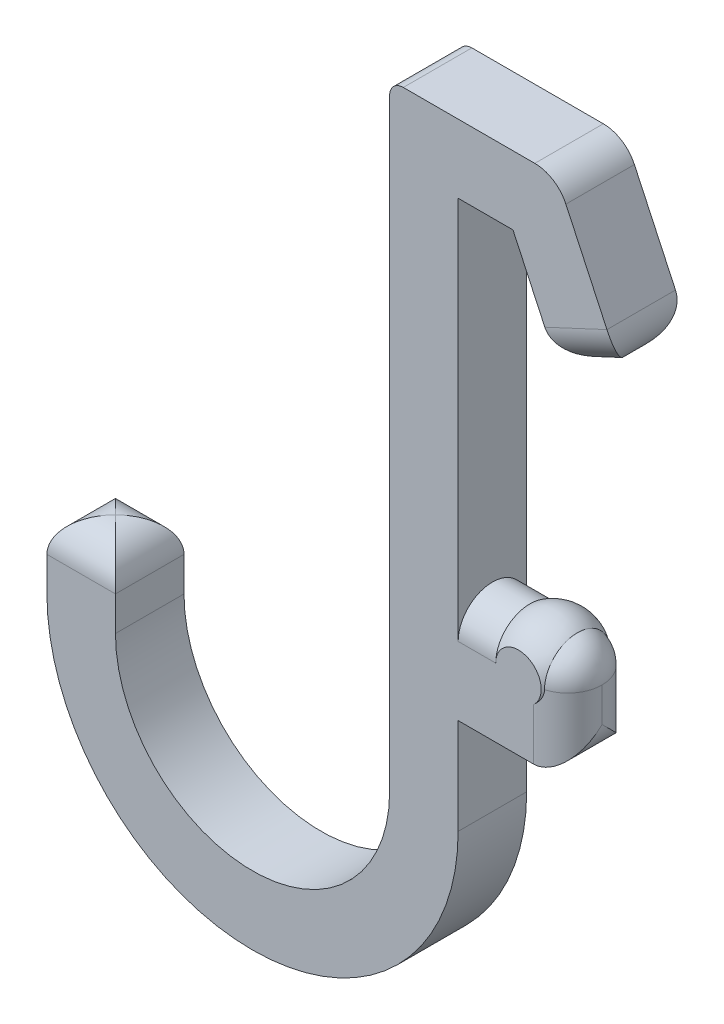
ISO-10303-21;
HEADER;
FILE_DESCRIPTION(('STEP AP214'),'2;1');
FILE_NAME('part.step','',(''),(''),'','','');
FILE_SCHEMA(('AUTOMOTIVE_DESIGN { 1 0 10303 214 1 1 1 1 }'));
ENDSEC;
DATA;
#1=APPLICATION_CONTEXT('core data for automotive mechanical design processes');
#2=APPLICATION_PROTOCOL_DEFINITION('international standard','automotive_design',2000,#1);
#3=PRODUCT_CONTEXT('',#1,'mechanical');
#4=PRODUCT('Part','Part','',(#3));
#5=PRODUCT_RELATED_PRODUCT_CATEGORY('part','',(#4));
#6=PRODUCT_DEFINITION_FORMATION('','',#4);
#7=PRODUCT_DEFINITION_CONTEXT('part definition',#1,'design');
#8=PRODUCT_DEFINITION('design','',#6,#7);
#9=PRODUCT_DEFINITION_SHAPE('','',#8);
#10=(LENGTH_UNIT() NAMED_UNIT(*) SI_UNIT(.MILLI.,.METRE.));
#11=(NAMED_UNIT(*) PLANE_ANGLE_UNIT() SI_UNIT($,.RADIAN.));
#12=(NAMED_UNIT(*) SI_UNIT($,.STERADIAN.) SOLID_ANGLE_UNIT());
#13=UNCERTAINTY_MEASURE_WITH_UNIT(LENGTH_MEASURE(1.E-05),#10,'distance_accuracy_value','');
#14=(GEOMETRIC_REPRESENTATION_CONTEXT(3) GLOBAL_UNCERTAINTY_ASSIGNED_CONTEXT((#13)) GLOBAL_UNIT_ASSIGNED_CONTEXT((#10,
#11,#12)) REPRESENTATION_CONTEXT('',''));
#15=CARTESIAN_POINT('',(0.,0.,0.));
#16=DIRECTION('',(0.,0.,1.));
#17=DIRECTION('',(1.,0.,0.));
#18=AXIS2_PLACEMENT_3D('',#15,#16,#17);
#19=CARTESIAN_POINT('',(13.5901699437495,0.,2.5));
#20=DIRECTION('',(-1.,0.,0.));
#21=DIRECTION('',(0.,0.,1.));
#22=AXIS2_PLACEMENT_3D('',#19,#20,#21);
#23=CYLINDRICAL_SURFACE('',#22,2.5);
#24=CARTESIAN_POINT('',(2.7416876048223,0.,2.5));
#25=DIRECTION('',(1.,0.,0.));
#26=DIRECTION('',(0.,0.,-1.));
#27=AXIS2_PLACEMENT_3D('',#24,#25,#26);
#28=CIRCLE('',#27,2.5);
#29=CARTESIAN_POINT('',(2.7416876048223,0.,0.));
#30=VERTEX_POINT('',#29);
#31=CARTESIAN_POINT('',(2.7416876048223,0.,5.));
#32=VERTEX_POINT('',#31);
#33=EDGE_CURVE('E239',#30,#32,#28,.T.);
#34=ORIENTED_EDGE('',*,*,#33,.F.);
#35=DIRECTION('',(-1.,0.,0.));
#36=VECTOR('',#35,1.);
#37=CARTESIAN_POINT('',(0.,0.,0.));
#38=LINE('',#37,#36);
#39=CARTESIAN_POINT('',(0.,0.,0.));
#40=VERTEX_POINT('',#39);
#41=EDGE_CURVE('E326',#30,#40,#38,.T.);
#42=ORIENTED_EDGE('',*,*,#41,.T.);
#43=CARTESIAN_POINT('',(0.,0.,2.5));
#44=DIRECTION('',(1.,0.,0.));
#45=DIRECTION('',(0.,0.,-1.));
#46=AXIS2_PLACEMENT_3D('',#43,#44,#45);
#47=CIRCLE('',#46,2.5);
#48=CARTESIAN_POINT('',(0.,0.,5.));
#49=VERTEX_POINT('',#48);
#50=EDGE_CURVE('E250',#40,#49,#47,.T.);
#51=ORIENTED_EDGE('',*,*,#50,.T.);
#52=DIRECTION('',(-1.,0.,0.));
#53=VECTOR('',#52,1.);
#54=CARTESIAN_POINT('',(0.,0.,5.));
#55=LINE('',#54,#53);
#56=EDGE_CURVE('E287',#32,#49,#55,.T.);
#57=ORIENTED_EDGE('',*,*,#56,.F.);
#58=EDGE_LOOP('',(#34,#42,#51,#57));
#59=FACE_BOUND('',#58,.T.);
#60=ADVANCED_FACE('F40',(#59),#23,.T.);
#61=CARTESIAN_POINT('',(5.5,0.,2.5));
#62=DIRECTION('',(0.,1.,0.));
#63=DIRECTION('',(0.,0.,1.));
#64=AXIS2_PLACEMENT_3D('',#61,#62,#63);
#65=CYLINDRICAL_SURFACE('',#64,2.5);
#66=DIRECTION('',(0.,1.,0.));
#67=VECTOR('',#66,1.);
#68=CARTESIAN_POINT('',(5.5,-12.,0.));
#69=LINE('',#68,#67);
#70=CARTESIAN_POINT('',(5.5,-1.24096736459909,0.));
#71=VERTEX_POINT('',#70);
#72=CARTESIAN_POINT('',(5.5,-5.,0.));
#73=VERTEX_POINT('',#72);
#74=EDGE_CURVE('E59',#71,#73,#69,.F.);
#75=ORIENTED_EDGE('',*,*,#74,.F.);
#76=CARTESIAN_POINT('',(5.4998,-1.24114463299005,8.00000016901504E-09));
#77=CARTESIAN_POINT('',(5.5363929673262,-1.2087029649529,-9.26164938524013E-06));
#78=CARTESIAN_POINT('',(5.57236876038989,-1.17555626849876,0.00079770122016531));
#79=CARTESIAN_POINT('',(5.6428030561148,-1.10769667819631,0.00383433659862395));
#80=CARTESIAN_POINT('',(5.67726031215857,-1.07298254322827,0.0060651555671746));
#81=CARTESIAN_POINT('',(5.74519128912905,-1.00095424317269,0.0118132669352872));
#82=CARTESIAN_POINT('',(5.77861573042543,-0.963595826296857,0.0153626740978217));
#83=CARTESIAN_POINT('',(5.84305795009588,-0.886981329738944,0.0234356736079334));
#84=CARTESIAN_POINT('',(5.8740762229525,-0.847725642663384,0.0279590650703918));
#85=CARTESIAN_POINT('',(5.96325201148396,-0.726269508254624,0.042561851108955));
#86=CARTESIAN_POINT('',(6.01705538420124,-0.640865596374251,0.0536260746175859));
#87=CARTESIAN_POINT('',(6.10655009460944,-0.461922147892546,0.074258393974845));
#88=CARTESIAN_POINT('',(6.14249859084772,-0.368522297372846,0.0838462716282918));
#89=CARTESIAN_POINT('',(6.17730370336194,-0.227795718404401,0.0934686773099391));
#90=CARTESIAN_POINT('',(6.18570287472368,-0.1829602446012,0.0958641595546958));
#91=CARTESIAN_POINT('',(6.19710907659667,-0.0920455434275466,0.0991560697495525));
#92=CARTESIAN_POINT('',(6.20005395659277,-0.0459579806521387,0.100035211650277));
#93=CARTESIAN_POINT('',(6.19999998181818,0.000200000000000188,0.0999999946969703));
#94=B_SPLINE_CURVE_WITH_KNOTS('',3,(#76,#77,#78,#79,#80,#81,#82,#83,#84,#85,#86,#87,#88,#89,#90,
#91,#92,#93),.UNSPECIFIED.,.F.,.F.,(4,2,2,2,2,2,2,2,4),(0.,0.146701218214616,0.29352070649968,
0.444179394748281,0.594807039223552,0.898088830284032,1.196865790681,1.3335683412279,
1.47181922641049),.UNSPECIFIED.);
#95=CARTESIAN_POINT('',(6.2,0.,0.100000000000001));
#96=VERTEX_POINT('',#95);
#97=EDGE_CURVE('E272',#71,#96,#94,.T.);
#98=ORIENTED_EDGE('',*,*,#97,.T.);
#99=CARTESIAN_POINT('',(5.5,0.,2.5));
#100=DIRECTION('',(0.,1.,0.));
#101=DIRECTION('',(0.,0.,1.));
#102=AXIS2_PLACEMENT_3D('',#99,#100,#101);
#103=CIRCLE('',#102,2.5);
#104=CARTESIAN_POINT('',(8.,0.,2.5));
#105=VERTEX_POINT('',#104);
#106=EDGE_CURVE('E82',#105,#96,#103,.T.);
#107=ORIENTED_EDGE('',*,*,#106,.F.);
#108=DIRECTION('',(0.,1.,0.));
#109=VECTOR('',#108,1.);
#110=CARTESIAN_POINT('',(8.,0.,2.5));
#111=LINE('',#110,#109);
#112=CARTESIAN_POINT('',(8.,-2.5,2.5));
#113=VERTEX_POINT('',#112);
#114=EDGE_CURVE('E243',#113,#105,#111,.T.);
#115=ORIENTED_EDGE('',*,*,#114,.F.);
#116=CARTESIAN_POINT('',(5.5,-2.5,2.5));
#117=DIRECTION('',(0.,0.707106781186547,-0.707106781186547));
#118=DIRECTION('',(0.,-0.707106781186547,-0.707106781186547));
#119=AXIS2_PLACEMENT_3D('',#116,#117,#118);
#120=ELLIPSE('',#119,3.53553390593274,2.5);
#121=EDGE_CURVE('E72',#73,#113,#120,.F.);
#122=ORIENTED_EDGE('',*,*,#121,.F.);
#123=EDGE_LOOP('',(#75,#98,#107,#115,#122));
#124=FACE_BOUND('',#123,.T.);
#125=ADVANCED_FACE('F42',(#124),#65,.T.);
#126=CARTESIAN_POINT('',(5.5,0.,2.5));
#127=DIRECTION('',(-1.,0.,0.));
#128=DIRECTION('',(0.,0.,1.));
#129=AXIS2_PLACEMENT_3D('',#126,#127,#128);
#130=SPHERICAL_SURFACE('',#129,2.5);
#131=ORIENTED_EDGE('',*,*,#106,.T.);
#132=CARTESIAN_POINT('',(6.2,0.,2.5));
#133=DIRECTION('',(-1.,0.,0.));
#134=DIRECTION('',(0.,0.,1.));
#135=AXIS2_PLACEMENT_3D('',#132,#133,#134);
#136=CIRCLE('',#135,2.4);
#137=CARTESIAN_POINT('',(6.2,0.,4.9));
#138=VERTEX_POINT('',#137);
#139=EDGE_CURVE('E280',#96,#138,#136,.F.);
#140=ORIENTED_EDGE('',*,*,#139,.T.);
#141=CARTESIAN_POINT('',(5.5,0.,2.5));
#142=DIRECTION('',(0.,-1.,0.));
#143=DIRECTION('',(0.,0.,-1.));
#144=AXIS2_PLACEMENT_3D('',#141,#142,#143);
#145=CIRCLE('',#144,2.5);
#146=EDGE_CURVE('E234',#105,#138,#145,.T.);
#147=ORIENTED_EDGE('',*,*,#146,.F.);
#148=EDGE_LOOP('',(#131,#140,#147));
#149=FACE_BOUND('',#148,.T.);
#150=ADVANCED_FACE('F515',(#149),#130,.T.);
#151=CARTESIAN_POINT('',(5.5,-12.,2.5));
#152=DIRECTION('',(0.,-1.,0.));
#153=DIRECTION('',(0.,0.,-1.));
#154=AXIS2_PLACEMENT_3D('',#151,#152,#153);
#155=CYLINDRICAL_SURFACE('',#154,2.5);
#156=ORIENTED_EDGE('',*,*,#146,.T.);
#157=CARTESIAN_POINT('',(6.19999998181818,0.0002,4.90000000530303));
#158=CARTESIAN_POINT('',(6.20002060593483,-0.0340215820751626,4.89998817316831));
#159=CARTESIAN_POINT('',(6.1984143593459,-0.0682209096207423,4.90046286433432));
#160=CARTESIAN_POINT('',(6.19208379810463,-0.136249463080852,4.90229830533756));
#161=CARTESIAN_POINT('',(6.18736474729119,-0.170079215952131,4.90365755930238));
#162=CARTESIAN_POINT('',(6.1689482938362,-0.269536910764676,4.90887369332737));
#163=CARTESIAN_POINT('',(6.15098131886339,-0.334336983187606,4.91387497360715));
#164=CARTESIAN_POINT('',(6.09808868579219,-0.48085117024676,4.92759913373652));
#165=CARTESIAN_POINT('',(6.05953499991633,-0.561148858343043,4.9370045157109));
#166=CARTESIAN_POINT('',(5.97007827325949,-0.715449277029459,4.9558368542023));
#167=CARTESIAN_POINT('',(5.91904380010561,-0.789372868652355,4.96526290588241));
#168=CARTESIAN_POINT('',(5.80922506209963,-0.929818254648965,4.98141526656959));
#169=CARTESIAN_POINT('',(5.75055545651681,-0.996426935956446,4.98817650123594));
#170=CARTESIAN_POINT('',(5.65870838300495,-1.09170672728009,4.99514321976577));
#171=CARTESIAN_POINT('',(5.62774086496115,-1.12244386881611,4.99693401300135));
#172=CARTESIAN_POINT('',(5.56461568283012,-1.1826876244331,4.99936451304459));
#173=CARTESIAN_POINT('',(5.53245860969331,-1.21219483443042,5.00000478377816));
#174=CARTESIAN_POINT('',(5.4998,-1.24114463299005,4.999999992));
#175=B_SPLINE_CURVE_WITH_KNOTS('',3,(#157,#158,#159,#160,#161,#162,#163,#164,#165,#166,#167,
#168,#169,#170,#171,#172,#173,#174),.UNSPECIFIED.,.F.,.F.,(4,2,2,2,2,2,2,2,4),(0.,
0.102583403755103,0.204993779301412,0.406260766109182,0.673486519863847,0.943657669752399,
1.21015973265302,1.34112701736425,1.47203009124063),.UNSPECIFIED.);
#176=CARTESIAN_POINT('',(5.5,-1.24096736459909,5.));
#177=VERTEX_POINT('',#176);
#178=EDGE_CURVE('E233',#138,#177,#175,.T.);
#179=ORIENTED_EDGE('',*,*,#178,.T.);
#180=DIRECTION('',(0.,1.,0.));
#181=VECTOR('',#180,1.);
#182=CARTESIAN_POINT('',(5.5,0.,5.));
#183=LINE('',#182,#181);
#184=CARTESIAN_POINT('',(5.5,-5.,5.));
#185=VERTEX_POINT('',#184);
#186=EDGE_CURVE('E222',#185,#177,#183,.T.);
#187=ORIENTED_EDGE('',*,*,#186,.F.);
#188=CARTESIAN_POINT('',(5.5,-2.5,2.5));
#189=DIRECTION('',(0.,-0.707106781186547,-0.707106781186547));
#190=DIRECTION('',(0.,0.707106781186547,-0.707106781186547));
#191=AXIS2_PLACEMENT_3D('',#188,#189,#190);
#192=ELLIPSE('',#191,3.53553390593274,2.5);
#193=EDGE_CURVE('E238',#185,#113,#192,.F.);
#194=ORIENTED_EDGE('',*,*,#193,.T.);
#195=ORIENTED_EDGE('',*,*,#114,.T.);
#196=EDGE_LOOP('',(#156,#179,#187,#194,#195));
#197=FACE_BOUND('',#196,.T.);
#198=ADVANCED_FACE('F259',(#197),#155,.T.);
#199=CARTESIAN_POINT('',(0.,0.,5.));
#200=DIRECTION('',(-1.,0.,0.));
#201=DIRECTION('',(0.,0.,1.));
#202=AXIS2_PLACEMENT_3D('',#199,#200,#201);
#203=PLANE('',#202);
#204=ORIENTED_EDGE('',*,*,#50,.F.);
#205=DIRECTION('',(0.,1.,0.));
#206=VECTOR('',#205,1.);
#207=CARTESIAN_POINT('',(0.,0.,0.));
#208=LINE('',#207,#206);
#209=CARTESIAN_POINT('',(0.,28.,0.));
#210=VERTEX_POINT('',#209);
#211=EDGE_CURVE('E329',#40,#210,#208,.T.);
#212=ORIENTED_EDGE('',*,*,#211,.T.);
#213=DIRECTION('',(0.,0.,-1.));
#214=VECTOR('',#213,1.);
#215=CARTESIAN_POINT('',(0.,28.,5.));
#216=LINE('',#215,#214);
#217=CARTESIAN_POINT('',(0.,28.,5.));
#218=VERTEX_POINT('',#217);
#219=EDGE_CURVE('E390',#218,#210,#216,.T.);
#220=ORIENTED_EDGE('',*,*,#219,.F.);
#221=DIRECTION('',(0.,1.,0.));
#222=VECTOR('',#221,1.);
#223=CARTESIAN_POINT('',(0.,0.,5.));
#224=LINE('',#223,#222);
#225=EDGE_CURVE('E290',#49,#218,#224,.T.);
#226=ORIENTED_EDGE('',*,*,#225,.F.);
#227=EDGE_LOOP('',(#204,#212,#220,#226));
#228=FACE_BOUND('',#227,.T.);
#229=ADVANCED_FACE('F527',(#228),#203,.F.);
#230=CARTESIAN_POINT('',(0.,28.,5.));
#231=DIRECTION('',(0.,1.,0.));
#232=DIRECTION('',(0.,0.,1.));
#233=AXIS2_PLACEMENT_3D('',#230,#231,#232);
#234=PLANE('',#233);
#235=DIRECTION('',(1.,0.,0.));
#236=VECTOR('',#235,1.);
#237=CARTESIAN_POINT('',(0.,28.,0.));
#238=LINE('',#237,#236);
#239=CARTESIAN_POINT('',(4.,28.,0.));
#240=VERTEX_POINT('',#239);
#241=EDGE_CURVE('E333',#210,#240,#238,.T.);
#242=ORIENTED_EDGE('',*,*,#241,.T.);
#243=DIRECTION('',(0.,0.,-1.));
#244=VECTOR('',#243,1.);
#245=CARTESIAN_POINT('',(4.,28.,5.));
#246=LINE('',#245,#244);
#247=CARTESIAN_POINT('',(4.,28.,5.));
#248=VERTEX_POINT('',#247);
#249=EDGE_CURVE('E386',#248,#240,#246,.T.);
#250=ORIENTED_EDGE('',*,*,#249,.F.);
#251=DIRECTION('',(1.,0.,0.));
#252=VECTOR('',#251,1.);
#253=CARTESIAN_POINT('',(0.,28.,5.));
#254=LINE('',#253,#252);
#255=EDGE_CURVE('E294',#218,#248,#254,.T.);
#256=ORIENTED_EDGE('',*,*,#255,.F.);
#257=ORIENTED_EDGE('',*,*,#219,.T.);
#258=EDGE_LOOP('',(#242,#250,#256,#257));
#259=FACE_BOUND('',#258,.T.);
#260=ADVANCED_FACE('F532',(#259),#234,.F.);
#261=CARTESIAN_POINT('',(4.,28.,5.));
#262=DIRECTION('',(0.906307787036651,0.422618261740697,0.));
#263=DIRECTION('',(-0.422618261740697,0.906307787036651,0.));
#264=AXIS2_PLACEMENT_3D('',#261,#262,#263);
#265=PLANE('',#264);
#266=DIRECTION('',(0.422618261740697,-0.906307787036651,0.));
#267=VECTOR('',#266,1.);
#268=CARTESIAN_POINT('',(4.,28.,0.));
#269=LINE('',#268,#267);
#270=CARTESIAN_POINT('',(6.32440043957384,23.0153071712984,0.));
#271=VERTEX_POINT('',#270);
#272=EDGE_CURVE('E336',#240,#271,#269,.T.);
#273=ORIENTED_EDGE('',*,*,#272,.T.);
#274=DIRECTION('',(0.,0.,-1.));
#275=VECTOR('',#274,1.);
#276=CARTESIAN_POINT('',(6.32440043957383,23.0153071712984,5.));
#277=LINE('',#276,#275);
#278=CARTESIAN_POINT('',(6.32440043957383,23.0153071712984,5.));
#279=VERTEX_POINT('',#278);
#280=EDGE_CURVE('E394',#271,#279,#277,.F.);
#281=ORIENTED_EDGE('',*,*,#280,.T.);
#282=DIRECTION('',(0.422618261740697,-0.906307787036651,0.));
#283=VECTOR('',#282,1.);
#284=CARTESIAN_POINT('',(4.,28.,5.));
#285=LINE('',#284,#283);
#286=EDGE_CURVE('E297',#248,#279,#285,.T.);
#287=ORIENTED_EDGE('',*,*,#286,.F.);
#288=ORIENTED_EDGE('',*,*,#249,.T.);
#289=EDGE_LOOP('',(#273,#281,#287,#288));
#290=FACE_BOUND('',#289,.T.);
#291=ADVANCED_FACE('F534',(#290),#265,.F.);
#292=CARTESIAN_POINT('',(11.9124850291088,22.8626290124103,5.));
#293=DIRECTION('',(-0.906307787036651,-0.422618261740697,0.));
#294=DIRECTION('',(0.422618261740697,-0.906307787036651,0.));
#295=AXIS2_PLACEMENT_3D('',#292,#293,#294);
#296=PLANE('',#295);
#297=DIRECTION('',(-0.422618261740697,0.906307787036651,0.));
#298=VECTOR('',#297,1.);
#299=CARTESIAN_POINT('',(11.9124850291088,22.8626290124103,5.));
#300=LINE('',#299,#298);
#301=CARTESIAN_POINT('',(10.8559393747571,25.1283984800019,5.));
#302=VERTEX_POINT('',#301);
#303=CARTESIAN_POINT('',(7.85844511961037,31.5565456543517,5.));
#304=VERTEX_POINT('',#303);
#305=EDGE_CURVE('E215',#302,#304,#300,.T.);
#306=ORIENTED_EDGE('',*,*,#305,.F.);
#307=DIRECTION('',(0.,0.,-1.));
#308=VECTOR('',#307,1.);
#309=CARTESIAN_POINT('',(10.8559393747571,25.1283984800019,5.));
#310=LINE('',#309,#308);
#311=CARTESIAN_POINT('',(10.8559393747571,25.1283984800019,0.));
#312=VERTEX_POINT('',#311);
#313=EDGE_CURVE('E409',#302,#312,#310,.T.);
#314=ORIENTED_EDGE('',*,*,#313,.T.);
#315=DIRECTION('',(-0.422618261740697,0.906307787036651,0.));
#316=VECTOR('',#315,1.);
#317=CARTESIAN_POINT('',(11.9124850291088,22.8626290124103,0.));
#318=LINE('',#317,#316);
#319=CARTESIAN_POINT('',(7.85844511961037,31.5565456543517,0.));
#320=VERTEX_POINT('',#319);
#321=EDGE_CURVE('E340',#312,#320,#318,.T.);
#322=ORIENTED_EDGE('',*,*,#321,.T.);
#323=DIRECTION('',(0.,0.,-1.));
#324=VECTOR('',#323,1.);
#325=CARTESIAN_POINT('',(7.85844511961037,31.5565456543517,5.));
#326=LINE('',#325,#324);
#327=EDGE_CURVE('E406',#320,#304,#326,.F.);
#328=ORIENTED_EDGE('',*,*,#327,.T.);
#329=EDGE_LOOP('',(#306,#314,#322,#328));
#330=FACE_BOUND('',#329,.T.);
#331=ADVANCED_FACE('F548',(#330),#296,.F.);
#332=CARTESIAN_POINT('',(-5.,33.,5.));
#333=DIRECTION('',(0.,-1.,0.));
#334=DIRECTION('',(0.,0.,-1.));
#335=AXIS2_PLACEMENT_3D('',#332,#333,#334);
#336=PLANE('',#335);
#337=DIRECTION('',(-1.,0.,0.));
#338=VECTOR('',#337,1.);
#339=CARTESIAN_POINT('',(-5.,33.,0.));
#340=LINE('',#339,#338);
#341=CARTESIAN_POINT('',(5.59267565201873,33.,0.));
#342=VERTEX_POINT('',#341);
#343=CARTESIAN_POINT('',(-4.,33.,0.));
#344=VERTEX_POINT('',#343);
#345=EDGE_CURVE('E201',#342,#344,#340,.T.);
#346=ORIENTED_EDGE('',*,*,#345,.T.);
#347=DIRECTION('',(0.,0.,-1.));
#348=VECTOR('',#347,1.);
#349=CARTESIAN_POINT('',(-4.,33.,5.));
#350=LINE('',#349,#348);
#351=CARTESIAN_POINT('',(-4.,33.,5.));
#352=VERTEX_POINT('',#351);
#353=EDGE_CURVE('E194',#344,#352,#350,.F.);
#354=ORIENTED_EDGE('',*,*,#353,.T.);
#355=DIRECTION('',(-1.,0.,0.));
#356=VECTOR('',#355,1.);
#357=CARTESIAN_POINT('',(-5.,33.,5.));
#358=LINE('',#357,#356);
#359=CARTESIAN_POINT('',(5.59267565201873,33.,5.));
#360=VERTEX_POINT('',#359);
#361=EDGE_CURVE('E198',#360,#352,#358,.T.);
#362=ORIENTED_EDGE('',*,*,#361,.F.);
#363=DIRECTION('',(0.,0.,-1.));
#364=VECTOR('',#363,1.);
#365=CARTESIAN_POINT('',(5.59267565201874,33.,5.));
#366=LINE('',#365,#364);
#367=EDGE_CURVE('E428',#360,#342,#366,.T.);
#368=ORIENTED_EDGE('',*,*,#367,.T.);
#369=EDGE_LOOP('',(#346,#354,#362,#368));
#370=FACE_BOUND('',#369,.T.);
#371=ADVANCED_FACE('F196',(#370),#336,.F.);
#372=CARTESIAN_POINT('',(-5.,33.,5.));
#373=DIRECTION('',(1.,0.,0.));
#374=DIRECTION('',(0.,1.,0.));
#375=AXIS2_PLACEMENT_3D('',#372,#373,#374);
#376=PLANE('',#375);
#377=DIRECTION('',(0.,-1.,0.));
#378=VECTOR('',#377,1.);
#379=CARTESIAN_POINT('',(-5.,33.,5.));
#380=LINE('',#379,#378);
#381=CARTESIAN_POINT('',(-5.,32.,5.));
#382=VERTEX_POINT('',#381);
#383=CARTESIAN_POINT('',(-4.99999999999999,-12.,5.));
#384=VERTEX_POINT('',#383);
#385=EDGE_CURVE('E214',#382,#384,#380,.T.);
#386=ORIENTED_EDGE('',*,*,#385,.F.);
#387=DIRECTION('',(0.,0.,-1.));
#388=VECTOR('',#387,1.);
#389=CARTESIAN_POINT('',(-5.,32.,5.));
#390=LINE('',#389,#388);
#391=CARTESIAN_POINT('',(-5.,32.,0.));
#392=VERTEX_POINT('',#391);
#393=EDGE_CURVE('E220',#382,#392,#390,.T.);
#394=ORIENTED_EDGE('',*,*,#393,.T.);
#395=DIRECTION('',(0.,-1.,0.));
#396=VECTOR('',#395,1.);
#397=CARTESIAN_POINT('',(-5.,33.,0.));
#398=LINE('',#397,#396);
#399=CARTESIAN_POINT('',(-4.99999999999999,-12.,0.));
#400=VERTEX_POINT('',#399);
#401=EDGE_CURVE('E346',#392,#400,#398,.T.);
#402=ORIENTED_EDGE('',*,*,#401,.T.);
#403=DIRECTION('',(0.,0.,-1.));
#404=VECTOR('',#403,1.);
#405=CARTESIAN_POINT('',(-4.99999999999999,-12.,5.));
#406=LINE('',#405,#404);
#407=EDGE_CURVE('E382',#384,#400,#406,.T.);
#408=ORIENTED_EDGE('',*,*,#407,.F.);
#409=EDGE_LOOP('',(#386,#394,#402,#408));
#410=FACE_BOUND('',#409,.T.);
#411=ADVANCED_FACE('F466',(#410),#376,.F.);
#412=CARTESIAN_POINT('',(-15.,-12.,5.));
#413=DIRECTION('',(0.,0.,-1.));
#414=DIRECTION('',(-1.,0.,0.));
#415=AXIS2_PLACEMENT_3D('',#412,#413,#414);
#416=CYLINDRICAL_SURFACE('',#415,10.);
#417=CARTESIAN_POINT('',(-15.,-12.,0.));
#418=DIRECTION('',(0.,0.,-1.));
#419=DIRECTION('',(1.,0.,0.));
#420=AXIS2_PLACEMENT_3D('',#417,#418,#419);
#421=CIRCLE('',#420,10.);
#422=CARTESIAN_POINT('',(-25.,-12.,0.));
#423=VERTEX_POINT('',#422);
#424=EDGE_CURVE('E349',#400,#423,#421,.T.);
#425=ORIENTED_EDGE('',*,*,#424,.T.);
#426=DIRECTION('',(0.,0.,-1.));
#427=VECTOR('',#426,1.);
#428=CARTESIAN_POINT('',(-25.,-12.,5.));
#429=LINE('',#428,#427);
#430=CARTESIAN_POINT('',(-25.,-12.,5.));
#431=VERTEX_POINT('',#430);
#432=EDGE_CURVE('E378',#431,#423,#429,.T.);
#433=ORIENTED_EDGE('',*,*,#432,.F.);
#434=CARTESIAN_POINT('',(-15.,-12.,5.));
#435=DIRECTION('',(0.,0.,-1.));
#436=DIRECTION('',(1.,0.,0.));
#437=AXIS2_PLACEMENT_3D('',#434,#435,#436);
#438=CIRCLE('',#437,10.);
#439=EDGE_CURVE('E305',#384,#431,#438,.T.);
#440=ORIENTED_EDGE('',*,*,#439,.F.);
#441=ORIENTED_EDGE('',*,*,#407,.T.);
#442=EDGE_LOOP('',(#425,#433,#440,#441));
#443=FACE_BOUND('',#442,.T.);
#444=ADVANCED_FACE('F472',(#443),#416,.F.);
#445=CARTESIAN_POINT('',(-25.,-12.,5.));
#446=DIRECTION('',(-1.,0.,0.));
#447=DIRECTION('',(0.,0.,1.));
#448=AXIS2_PLACEMENT_3D('',#445,#446,#447);
#449=PLANE('',#448);
#450=DIRECTION('',(0.,1.,0.));
#451=VECTOR('',#450,1.);
#452=CARTESIAN_POINT('',(-25.,-12.,0.));
#453=LINE('',#452,#451);
#454=CARTESIAN_POINT('',(-25.,-9.49999999999999,0.));
#455=VERTEX_POINT('',#454);
#456=EDGE_CURVE('E352',#423,#455,#453,.T.);
#457=ORIENTED_EDGE('',*,*,#456,.T.);
#458=DIRECTION('',(0.,0.,-1.));
#459=VECTOR('',#458,1.);
#460=CARTESIAN_POINT('',(-25.,-9.49999999999999,5.));
#461=LINE('',#460,#459);
#462=CARTESIAN_POINT('',(-25.,-9.49999999999999,5.));
#463=VERTEX_POINT('',#462);
#464=EDGE_CURVE('E421',#455,#463,#461,.F.);
#465=ORIENTED_EDGE('',*,*,#464,.T.);
#466=DIRECTION('',(0.,1.,0.));
#467=VECTOR('',#466,1.);
#468=CARTESIAN_POINT('',(-25.,-12.,5.));
#469=LINE('',#468,#467);
#470=EDGE_CURVE('E308',#431,#463,#469,.T.);
#471=ORIENTED_EDGE('',*,*,#470,.F.);
#472=ORIENTED_EDGE('',*,*,#432,.T.);
#473=EDGE_LOOP('',(#457,#465,#471,#472));
#474=FACE_BOUND('',#473,.T.);
#475=ADVANCED_FACE('F475',(#474),#449,.F.);
#476=CARTESIAN_POINT('',(-30.,-6.99999999999999,5.));
#477=DIRECTION('',(1.,0.,0.));
#478=DIRECTION('',(0.,0.,-1.));
#479=AXIS2_PLACEMENT_3D('',#476,#477,#478);
#480=PLANE('',#479);
#481=DIRECTION('',(0.,-1.,0.));
#482=VECTOR('',#481,1.);
#483=CARTESIAN_POINT('',(-30.,-6.99999999999999,5.));
#484=LINE('',#483,#482);
#485=CARTESIAN_POINT('',(-30.,-9.49999999999999,5.));
#486=VERTEX_POINT('',#485);
#487=CARTESIAN_POINT('',(-30.,-12.,5.));
#488=VERTEX_POINT('',#487);
#489=EDGE_CURVE('E312',#486,#488,#484,.T.);
#490=ORIENTED_EDGE('',*,*,#489,.F.);
#491=DIRECTION('',(0.,0.,-1.));
#492=VECTOR('',#491,1.);
#493=CARTESIAN_POINT('',(-30.,-9.49999999999999,5.));
#494=LINE('',#493,#492);
#495=CARTESIAN_POINT('',(-30.,-9.49999999999999,0.));
#496=VERTEX_POINT('',#495);
#497=EDGE_CURVE('E425',#486,#496,#494,.T.);
#498=ORIENTED_EDGE('',*,*,#497,.T.);
#499=DIRECTION('',(0.,-1.,0.));
#500=VECTOR('',#499,1.);
#501=CARTESIAN_POINT('',(-30.,-6.99999999999999,0.));
#502=LINE('',#501,#500);
#503=CARTESIAN_POINT('',(-30.,-12.,0.));
#504=VERTEX_POINT('',#503);
#505=EDGE_CURVE('E356',#496,#504,#502,.T.);
#506=ORIENTED_EDGE('',*,*,#505,.T.);
#507=DIRECTION('',(0.,0.,-1.));
#508=VECTOR('',#507,1.);
#509=CARTESIAN_POINT('',(-30.,-12.,5.));
#510=LINE('',#509,#508);
#511=EDGE_CURVE('E374',#488,#504,#510,.T.);
#512=ORIENTED_EDGE('',*,*,#511,.F.);
#513=EDGE_LOOP('',(#490,#498,#506,#512));
#514=FACE_BOUND('',#513,.T.);
#515=ADVANCED_FACE('F493',(#514),#480,.F.);
#516=CARTESIAN_POINT('',(-15.,-12.,5.));
#517=DIRECTION('',(0.,0.,-1.));
#518=DIRECTION('',(-1.,0.,0.));
#519=AXIS2_PLACEMENT_3D('',#516,#517,#518);
#520=CYLINDRICAL_SURFACE('',#519,15.);
#521=CARTESIAN_POINT('',(-15.,-12.,0.));
#522=DIRECTION('',(0.,0.,1.));
#523=DIRECTION('',(1.,0.,0.));
#524=AXIS2_PLACEMENT_3D('',#521,#522,#523);
#525=CIRCLE('',#524,15.);
#526=CARTESIAN_POINT('',(0.,-12.,0.));
#527=VERTEX_POINT('',#526);
#528=EDGE_CURVE('E359',#504,#527,#525,.T.);
#529=ORIENTED_EDGE('',*,*,#528,.T.);
#530=DIRECTION('',(0.,0.,-1.));
#531=VECTOR('',#530,1.);
#532=CARTESIAN_POINT('',(0.,-12.,5.));
#533=LINE('',#532,#531);
#534=CARTESIAN_POINT('',(0.,-12.,5.));
#535=VERTEX_POINT('',#534);
#536=EDGE_CURVE('E370',#535,#527,#533,.T.);
#537=ORIENTED_EDGE('',*,*,#536,.F.);
#538=CARTESIAN_POINT('',(-15.,-12.,5.));
#539=DIRECTION('',(0.,0.,1.));
#540=DIRECTION('',(1.,0.,0.));
#541=AXIS2_PLACEMENT_3D('',#538,#539,#540);
#542=CIRCLE('',#541,15.);
#543=EDGE_CURVE('E315',#488,#535,#542,.T.);
#544=ORIENTED_EDGE('',*,*,#543,.F.);
#545=ORIENTED_EDGE('',*,*,#511,.T.);
#546=EDGE_LOOP('',(#529,#537,#544,#545));
#547=FACE_BOUND('',#546,.T.);
#548=ADVANCED_FACE('F637',(#547),#520,.T.);
#549=CARTESIAN_POINT('',(0.,-5.,5.));
#550=DIRECTION('',(-1.,0.,0.));
#551=DIRECTION('',(0.,-1.,0.));
#552=AXIS2_PLACEMENT_3D('',#549,#550,#551);
#553=PLANE('',#552);
#554=DIRECTION('',(0.,1.,0.));
#555=VECTOR('',#554,1.);
#556=CARTESIAN_POINT('',(0.,-5.,0.));
#557=LINE('',#556,#555);
#558=CARTESIAN_POINT('',(0.,-5.,0.));
#559=VERTEX_POINT('',#558);
#560=EDGE_CURVE('E362',#527,#559,#557,.T.);
#561=ORIENTED_EDGE('',*,*,#560,.T.);
#562=DIRECTION('',(0.,0.,-1.));
#563=VECTOR('',#562,1.);
#564=CARTESIAN_POINT('',(0.,-5.,5.));
#565=LINE('',#564,#563);
#566=CARTESIAN_POINT('',(0.,-5.,5.));
#567=VERTEX_POINT('',#566);
#568=EDGE_CURVE('E325',#567,#559,#565,.T.);
#569=ORIENTED_EDGE('',*,*,#568,.F.);
#570=DIRECTION('',(0.,1.,0.));
#571=VECTOR('',#570,1.);
#572=CARTESIAN_POINT('',(0.,-5.,5.));
#573=LINE('',#572,#571);
#574=EDGE_CURVE('E318',#535,#567,#573,.T.);
#575=ORIENTED_EDGE('',*,*,#574,.F.);
#576=ORIENTED_EDGE('',*,*,#536,.T.);
#577=EDGE_LOOP('',(#561,#569,#575,#576));
#578=FACE_BOUND('',#577,.T.);
#579=ADVANCED_FACE('F628',(#578),#553,.F.);
#580=CARTESIAN_POINT('',(8.,-5.,5.));
#581=DIRECTION('',(0.,1.,0.));
#582=DIRECTION('',(0.,0.,1.));
#583=AXIS2_PLACEMENT_3D('',#580,#581,#582);
#584=PLANE('',#583);
#585=DIRECTION('',(1.,0.,0.));
#586=VECTOR('',#585,1.);
#587=CARTESIAN_POINT('',(8.,-5.,0.));
#588=LINE('',#587,#586);
#589=EDGE_CURVE('E291',#559,#73,#588,.T.);
#590=ORIENTED_EDGE('',*,*,#589,.T.);
#591=DIRECTION('',(0.,0.,-1.));
#592=VECTOR('',#591,1.);
#593=CARTESIAN_POINT('',(5.5,-5.,5.));
#594=LINE('',#593,#592);
#595=EDGE_CURVE('E230',#73,#185,#594,.F.);
#596=ORIENTED_EDGE('',*,*,#595,.T.);
#597=DIRECTION('',(1.,0.,0.));
#598=VECTOR('',#597,1.);
#599=CARTESIAN_POINT('',(8.,-5.,5.));
#600=LINE('',#599,#598);
#601=EDGE_CURVE('E321',#567,#185,#600,.T.);
#602=ORIENTED_EDGE('',*,*,#601,.F.);
#603=ORIENTED_EDGE('',*,*,#568,.T.);
#604=EDGE_LOOP('',(#590,#596,#602,#603));
#605=FACE_BOUND('',#604,.T.);
#606=ADVANCED_FACE('F607',(#605),#584,.F.);
#607=CARTESIAN_POINT('',(-15.,-12.,5.));
#608=DIRECTION('',(0.,0.,1.));
#609=DIRECTION('',(1.,0.,0.));
#610=AXIS2_PLACEMENT_3D('',#607,#608,#609);
#611=PLANE('',#610);
#612=ORIENTED_EDGE('',*,*,#186,.T.);
#613=CARTESIAN_POINT('',(4.4,0.,5.));
#614=DIRECTION('',(0.,0.,-1.));
#615=DIRECTION('',(-1.,0.,0.));
#616=AXIS2_PLACEMENT_3D('',#613,#614,#615);
#617=CIRCLE('',#616,1.6583123951777);
#618=EDGE_CURVE('E51',#32,#177,#617,.T.);
#619=ORIENTED_EDGE('',*,*,#618,.F.);
#620=ORIENTED_EDGE('',*,*,#56,.T.);
#621=ORIENTED_EDGE('',*,*,#225,.T.);
#622=ORIENTED_EDGE('',*,*,#255,.T.);
#623=ORIENTED_EDGE('',*,*,#286,.T.);
#624=DIRECTION('',(0.906307787036651,0.422618261740698,0.));
#625=VECTOR('',#624,1.);
#626=CARTESIAN_POINT('',(10.8559393747571,25.1283984800019,5.));
#627=LINE('',#626,#625);
#628=EDGE_CURVE('E403',#279,#302,#627,.T.);
#629=ORIENTED_EDGE('',*,*,#628,.T.);
#630=ORIENTED_EDGE('',*,*,#305,.T.);
#631=CARTESIAN_POINT('',(5.59267565201874,30.5,5.));
#632=DIRECTION('',(0.,0.,1.));
#633=DIRECTION('',(1.,0.,0.));
#634=AXIS2_PLACEMENT_3D('',#631,#632,#633);
#635=CIRCLE('',#634,2.5);
#636=EDGE_CURVE('E212',#304,#360,#635,.T.);
#637=ORIENTED_EDGE('',*,*,#636,.T.);
#638=ORIENTED_EDGE('',*,*,#361,.T.);
#639=CARTESIAN_POINT('',(-4.,32.,5.));
#640=DIRECTION('',(0.,0.,1.));
#641=DIRECTION('',(1.,0.,0.));
#642=AXIS2_PLACEMENT_3D('',#639,#640,#641);
#643=CIRCLE('',#642,1.);
#644=EDGE_CURVE('E205',#352,#382,#643,.T.);
#645=ORIENTED_EDGE('',*,*,#644,.T.);
#646=ORIENTED_EDGE('',*,*,#385,.T.);
#647=ORIENTED_EDGE('',*,*,#439,.T.);
#648=ORIENTED_EDGE('',*,*,#470,.T.);
#649=DIRECTION('',(-1.,0.,0.));
#650=VECTOR('',#649,1.);
#651=CARTESIAN_POINT('',(-30.,-9.49999999999999,5.));
#652=LINE('',#651,#650);
#653=EDGE_CURVE('E400',#463,#486,#652,.T.);
#654=ORIENTED_EDGE('',*,*,#653,.T.);
#655=ORIENTED_EDGE('',*,*,#489,.T.);
#656=ORIENTED_EDGE('',*,*,#543,.T.);
#657=ORIENTED_EDGE('',*,*,#574,.T.);
#658=ORIENTED_EDGE('',*,*,#601,.T.);
#659=EDGE_LOOP('',(#612,#619,#620,#621,#622,#623,#629,#630,#637,#638,#645,#646,#647,#648,#654,
#655,#656,#657,#658));
#660=FACE_BOUND('',#659,.T.);
#661=ADVANCED_FACE('F208',(#660),#611,.T.);
#662=CARTESIAN_POINT('',(-15.,-12.,0.));
#663=DIRECTION('',(0.,0.,1.));
#664=DIRECTION('',(1.,0.,0.));
#665=AXIS2_PLACEMENT_3D('',#662,#663,#664);
#666=PLANE('',#665);
#667=ORIENTED_EDGE('',*,*,#241,.F.);
#668=ORIENTED_EDGE('',*,*,#211,.F.);
#669=ORIENTED_EDGE('',*,*,#41,.F.);
#670=CARTESIAN_POINT('',(4.4,0.,0.));
#671=DIRECTION('',(0.,0.,1.));
#672=DIRECTION('',(1.,0.,0.));
#673=AXIS2_PLACEMENT_3D('',#670,#671,#672);
#674=CIRCLE('',#673,1.6583123951777);
#675=EDGE_CURVE('E11',#71,#30,#674,.T.);
#676=ORIENTED_EDGE('',*,*,#675,.F.);
#677=ORIENTED_EDGE('',*,*,#74,.T.);
#678=ORIENTED_EDGE('',*,*,#589,.F.);
#679=ORIENTED_EDGE('',*,*,#560,.F.);
#680=ORIENTED_EDGE('',*,*,#528,.F.);
#681=ORIENTED_EDGE('',*,*,#505,.F.);
#682=DIRECTION('',(-1.,0.,0.));
#683=VECTOR('',#682,1.);
#684=CARTESIAN_POINT('',(-15.,-9.49999999999999,0.));
#685=LINE('',#684,#683);
#686=EDGE_CURVE('E415',#496,#455,#685,.F.);
#687=ORIENTED_EDGE('',*,*,#686,.T.);
#688=ORIENTED_EDGE('',*,*,#456,.F.);
#689=ORIENTED_EDGE('',*,*,#424,.F.);
#690=ORIENTED_EDGE('',*,*,#401,.F.);
#691=CARTESIAN_POINT('',(-4.,32.,0.));
#692=DIRECTION('',(0.,0.,1.));
#693=DIRECTION('',(1.,0.,0.));
#694=AXIS2_PLACEMENT_3D('',#691,#692,#693);
#695=CIRCLE('',#694,1.);
#696=EDGE_CURVE('E206',#392,#344,#695,.F.);
#697=ORIENTED_EDGE('',*,*,#696,.T.);
#698=ORIENTED_EDGE('',*,*,#345,.F.);
#699=CARTESIAN_POINT('',(5.59267565201874,30.5,0.));
#700=DIRECTION('',(0.,0.,1.));
#701=DIRECTION('',(1.,0.,0.));
#702=AXIS2_PLACEMENT_3D('',#699,#700,#701);
#703=CIRCLE('',#702,2.5);
#704=EDGE_CURVE('E412',#342,#320,#703,.F.);
#705=ORIENTED_EDGE('',*,*,#704,.T.);
#706=ORIENTED_EDGE('',*,*,#321,.F.);
#707=DIRECTION('',(0.906307787036651,0.422618261740698,0.));
#708=VECTOR('',#707,1.);
#709=CARTESIAN_POINT('',(-24.6029707148278,8.59363715539898,0.));
#710=LINE('',#709,#708);
#711=EDGE_CURVE('E418',#312,#271,#710,.F.);
#712=ORIENTED_EDGE('',*,*,#711,.T.);
#713=ORIENTED_EDGE('',*,*,#272,.F.);
#714=EDGE_LOOP('',(#667,#668,#669,#676,#677,#678,#679,#680,#681,#687,#688,#689,#690,#697,#698,
#705,#706,#712,#713));
#715=FACE_BOUND('',#714,.T.);
#716=ADVANCED_FACE('F463',(#715),#666,.F.);
#717=CARTESIAN_POINT('',(8.59016990716546,24.0718528256502,5.));
#718=DIRECTION('',(0.,0.,-1.));
#719=DIRECTION('',(-1.,0.,0.));
#720=AXIS2_PLACEMENT_3D('',#717,#718,#719);
#721=CYLINDRICAL_SURFACE('',#720,2.5);
#722=CARTESIAN_POINT('',(8.59016990716546,24.0718528256502,2.5));
#723=DIRECTION('',(0.640856382055789,0.298836238730119,0.707106781186547));
#724=DIRECTION('',(0.640856382055789,0.298836238730119,-0.707106781186547));
#725=AXIS2_PLACEMENT_3D('',#722,#723,#724);
#726=ELLIPSE('',#725,3.53553390593274,2.5);
#727=CARTESIAN_POINT('',(9.64671556151721,21.8060833580585,2.5));
#728=VERTEX_POINT('',#727);
#729=EDGE_CURVE('E439',#312,#728,#726,.F.);
#730=ORIENTED_EDGE('',*,*,#729,.F.);
#731=ORIENTED_EDGE('',*,*,#313,.F.);
#732=CARTESIAN_POINT('',(8.59016990716546,24.0718528256502,2.5));
#733=DIRECTION('',(0.640856382055789,0.298836238730119,-0.707106781186547));
#734=DIRECTION('',(-0.640856382055789,-0.298836238730119,-0.707106781186547));
#735=AXIS2_PLACEMENT_3D('',#732,#733,#734);
#736=ELLIPSE('',#735,3.53553390593274,2.5);
#737=EDGE_CURVE('E330',#728,#302,#736,.F.);
#738=ORIENTED_EDGE('',*,*,#737,.F.);
#739=EDGE_LOOP('',(#730,#731,#738));
#740=FACE_BOUND('',#739,.T.);
#741=ADVANCED_FACE('F551',(#740),#721,.T.);
#742=CARTESIAN_POINT('',(-24.6029707148278,8.59363715539898,2.5));
#743=DIRECTION('',(-0.906307787036651,-0.422618261740698,0.));
#744=DIRECTION('',(0.422618261740698,-0.906307787036651,0.));
#745=AXIS2_PLACEMENT_3D('',#742,#743,#744);
#746=CYLINDRICAL_SURFACE('',#745,2.5);
#747=ORIENTED_EDGE('',*,*,#737,.T.);
#748=ORIENTED_EDGE('',*,*,#628,.F.);
#749=CARTESIAN_POINT('',(8.59016990716546,24.0718528256502,2.5));
#750=DIRECTION('',(-0.640856382055789,-0.298836238730119,-0.707106781186547));
#751=DIRECTION('',(-0.640856382055789,-0.298836238730119,0.707106781186547));
#752=AXIS2_PLACEMENT_3D('',#749,#750,#751);
#753=ELLIPSE('',#752,3.53553390593274,2.5);
#754=EDGE_CURVE('E435',#728,#279,#753,.T.);
#755=ORIENTED_EDGE('',*,*,#754,.F.);
#756=EDGE_LOOP('',(#747,#748,#755));
#757=FACE_BOUND('',#756,.T.);
#758=ADVANCED_FACE('F545',(#757),#746,.T.);
#759=CARTESIAN_POINT('',(6.32440043957383,23.0153071712984,2.5));
#760=DIRECTION('',(0.906307787036651,0.422618261740698,0.));
#761=DIRECTION('',(-0.422618261740698,0.906307787036651,0.));
#762=AXIS2_PLACEMENT_3D('',#759,#760,#761);
#763=CYLINDRICAL_SURFACE('',#762,2.5);
#764=ORIENTED_EDGE('',*,*,#711,.F.);
#765=ORIENTED_EDGE('',*,*,#729,.T.);
#766=CARTESIAN_POINT('',(8.59016990716546,24.0718528256502,2.5));
#767=DIRECTION('',(0.640856382055789,0.298836238730119,-0.707106781186547));
#768=DIRECTION('',(0.640856382055789,0.298836238730119,0.707106781186547));
#769=AXIS2_PLACEMENT_3D('',#766,#767,#768);
#770=ELLIPSE('',#769,3.53553390593274,2.5);
#771=EDGE_CURVE('E431',#271,#728,#770,.F.);
#772=ORIENTED_EDGE('',*,*,#771,.F.);
#773=EDGE_LOOP('',(#764,#765,#772));
#774=FACE_BOUND('',#773,.T.);
#775=ADVANCED_FACE('F505',(#774),#763,.T.);
#776=CARTESIAN_POINT('',(8.59016990716546,24.0718528256502,5.));
#777=DIRECTION('',(0.,0.,-1.));
#778=DIRECTION('',(-1.,0.,0.));
#779=AXIS2_PLACEMENT_3D('',#776,#777,#778);
#780=CYLINDRICAL_SURFACE('',#779,2.5);
#781=ORIENTED_EDGE('',*,*,#754,.T.);
#782=ORIENTED_EDGE('',*,*,#280,.F.);
#783=ORIENTED_EDGE('',*,*,#771,.T.);
#784=EDGE_LOOP('',(#781,#782,#783));
#785=FACE_BOUND('',#784,.T.);
#786=ADVANCED_FACE('F498',(#785),#780,.T.);
#787=CARTESIAN_POINT('',(-27.5,-9.49999999999999,5.));
#788=DIRECTION('',(0.,0.,-1.));
#789=DIRECTION('',(-1.,0.,0.));
#790=AXIS2_PLACEMENT_3D('',#787,#788,#789);
#791=CYLINDRICAL_SURFACE('',#790,2.5);
#792=CARTESIAN_POINT('',(-27.5,-9.49999999999999,2.5));
#793=DIRECTION('',(-0.707106781186547,0.,0.707106781186547));
#794=DIRECTION('',(-0.707106781186547,0.,-0.707106781186547));
#795=AXIS2_PLACEMENT_3D('',#792,#793,#794);
#796=ELLIPSE('',#795,3.53553390593274,2.5);
#797=CARTESIAN_POINT('',(-27.5,-6.99999999999999,2.5));
#798=VERTEX_POINT('',#797);
#799=EDGE_CURVE('E452',#496,#798,#796,.F.);
#800=ORIENTED_EDGE('',*,*,#799,.F.);
#801=ORIENTED_EDGE('',*,*,#497,.F.);
#802=CARTESIAN_POINT('',(-27.5,-9.49999999999999,2.5));
#803=DIRECTION('',(-0.707106781186547,0.,-0.707106781186547));
#804=DIRECTION('',(0.707106781186547,0.,-0.707106781186547));
#805=AXIS2_PLACEMENT_3D('',#802,#803,#804);
#806=ELLIPSE('',#805,3.53553390593274,2.5);
#807=EDGE_CURVE('E436',#798,#486,#806,.F.);
#808=ORIENTED_EDGE('',*,*,#807,.F.);
#809=EDGE_LOOP('',(#800,#801,#808));
#810=FACE_BOUND('',#809,.T.);
#811=ADVANCED_FACE('F496',(#810),#791,.T.);
#812=CARTESIAN_POINT('',(-15.,-9.49999999999999,2.5));
#813=DIRECTION('',(1.,0.,0.));
#814=DIRECTION('',(0.,1.,0.));
#815=AXIS2_PLACEMENT_3D('',#812,#813,#814);
#816=CYLINDRICAL_SURFACE('',#815,2.5);
#817=ORIENTED_EDGE('',*,*,#807,.T.);
#818=ORIENTED_EDGE('',*,*,#653,.F.);
#819=CARTESIAN_POINT('',(-27.5,-9.49999999999999,2.5));
#820=DIRECTION('',(0.707106781186547,0.,-0.707106781186547));
#821=DIRECTION('',(0.707106781186547,0.,0.707106781186547));
#822=AXIS2_PLACEMENT_3D('',#819,#820,#821);
#823=ELLIPSE('',#822,3.53553390593274,2.5);
#824=EDGE_CURVE('E449',#798,#463,#823,.T.);
#825=ORIENTED_EDGE('',*,*,#824,.F.);
#826=EDGE_LOOP('',(#817,#818,#825));
#827=FACE_BOUND('',#826,.T.);
#828=ADVANCED_FACE('F489',(#827),#816,.T.);
#829=CARTESIAN_POINT('',(-25.,-9.49999999999999,2.5));
#830=DIRECTION('',(-1.,0.,0.));
#831=DIRECTION('',(0.,-1.,0.));
#832=AXIS2_PLACEMENT_3D('',#829,#830,#831);
#833=CYLINDRICAL_SURFACE('',#832,2.5);
#834=ORIENTED_EDGE('',*,*,#686,.F.);
#835=ORIENTED_EDGE('',*,*,#799,.T.);
#836=CARTESIAN_POINT('',(-27.5,-9.49999999999999,2.5));
#837=DIRECTION('',(-0.707106781186547,0.,-0.707106781186547));
#838=DIRECTION('',(-0.707106781186547,0.,0.707106781186547));
#839=AXIS2_PLACEMENT_3D('',#836,#837,#838);
#840=ELLIPSE('',#839,3.53553390593274,2.5);
#841=EDGE_CURVE('E286',#455,#798,#840,.F.);
#842=ORIENTED_EDGE('',*,*,#841,.F.);
#843=EDGE_LOOP('',(#834,#835,#842));
#844=FACE_BOUND('',#843,.T.);
#845=ADVANCED_FACE('F484',(#844),#833,.T.);
#846=CARTESIAN_POINT('',(-27.5,-9.49999999999999,5.));
#847=DIRECTION('',(0.,0.,-1.));
#848=DIRECTION('',(-1.,0.,0.));
#849=AXIS2_PLACEMENT_3D('',#846,#847,#848);
#850=CYLINDRICAL_SURFACE('',#849,2.5);
#851=ORIENTED_EDGE('',*,*,#824,.T.);
#852=ORIENTED_EDGE('',*,*,#464,.F.);
#853=ORIENTED_EDGE('',*,*,#841,.T.);
#854=EDGE_LOOP('',(#851,#852,#853));
#855=FACE_BOUND('',#854,.T.);
#856=ADVANCED_FACE('F479',(#855),#850,.T.);
#857=CARTESIAN_POINT('',(5.59267565201874,30.5,5.));
#858=DIRECTION('',(0.,0.,-1.));
#859=DIRECTION('',(-1.,0.,0.));
#860=AXIS2_PLACEMENT_3D('',#857,#858,#859);
#861=CYLINDRICAL_SURFACE('',#860,2.5);
#862=ORIENTED_EDGE('',*,*,#636,.F.);
#863=ORIENTED_EDGE('',*,*,#327,.F.);
#864=ORIENTED_EDGE('',*,*,#704,.F.);
#865=ORIENTED_EDGE('',*,*,#367,.F.);
#866=EDGE_LOOP('',(#862,#863,#864,#865));
#867=FACE_BOUND('',#866,.T.);
#868=ADVANCED_FACE('F565',(#867),#861,.T.);
#869=CARTESIAN_POINT('',(-4.,32.,5.));
#870=DIRECTION('',(0.,0.,-1.));
#871=DIRECTION('',(-1.,0.,0.));
#872=AXIS2_PLACEMENT_3D('',#869,#870,#871);
#873=CYLINDRICAL_SURFACE('',#872,1.);
#874=ORIENTED_EDGE('',*,*,#644,.F.);
#875=ORIENTED_EDGE('',*,*,#353,.F.);
#876=ORIENTED_EDGE('',*,*,#696,.F.);
#877=ORIENTED_EDGE('',*,*,#393,.F.);
#878=EDGE_LOOP('',(#874,#875,#876,#877));
#879=FACE_BOUND('',#878,.T.);
#880=ADVANCED_FACE('F218',(#879),#873,.T.);
#881=CARTESIAN_POINT('',(5.5,-2.5,5.));
#882=DIRECTION('',(0.,0.,-1.));
#883=DIRECTION('',(-1.,0.,0.));
#884=AXIS2_PLACEMENT_3D('',#881,#882,#883);
#885=CYLINDRICAL_SURFACE('',#884,2.5);
#886=ORIENTED_EDGE('',*,*,#595,.F.);
#887=ORIENTED_EDGE('',*,*,#121,.T.);
#888=ORIENTED_EDGE('',*,*,#193,.F.);
#889=EDGE_LOOP('',(#886,#887,#888));
#890=FACE_BOUND('',#889,.T.);
#891=ADVANCED_FACE('F267',(#890),#885,.T.);
#892=CARTESIAN_POINT('',(4.4,0.,2.5));
#893=DIRECTION('',(0.,0.,1.));
#894=DIRECTION('',(0.,1.,0.));
#895=AXIS2_PLACEMENT_3D('',#892,#893,#894);
#896=SPHERICAL_SURFACE('',#895,3.);
#897=ORIENTED_EDGE('',*,*,#97,.F.);
#898=ORIENTED_EDGE('',*,*,#675,.T.);
#899=ORIENTED_EDGE('',*,*,#33,.T.);
#900=ORIENTED_EDGE('',*,*,#618,.T.);
#901=ORIENTED_EDGE('',*,*,#178,.F.);
#902=ORIENTED_EDGE('',*,*,#139,.F.);
#903=EDGE_LOOP('',(#897,#898,#899,#900,#901,#902));
#904=FACE_BOUND('',#903,.T.);
#905=ADVANCED_FACE('F263',(#904),#896,.T.);
#906=CLOSED_SHELL('',(#60,#125,#150,#198,#229,#260,#291,#331,#371,#411,#444,#475,#515,#548,#579,
#606,#661,#716,#741,#758,#775,#786,#811,#828,#845,#856,#868,#880,#891,#905));
#907=MANIFOLD_SOLID_BREP('B2',#906);
#908=ADVANCED_BREP_SHAPE_REPRESENTATION('',(#18,#907),#14);
#909=SHAPE_DEFINITION_REPRESENTATION(#9,#908);
ENDSEC;
END-ISO-10303-21;
